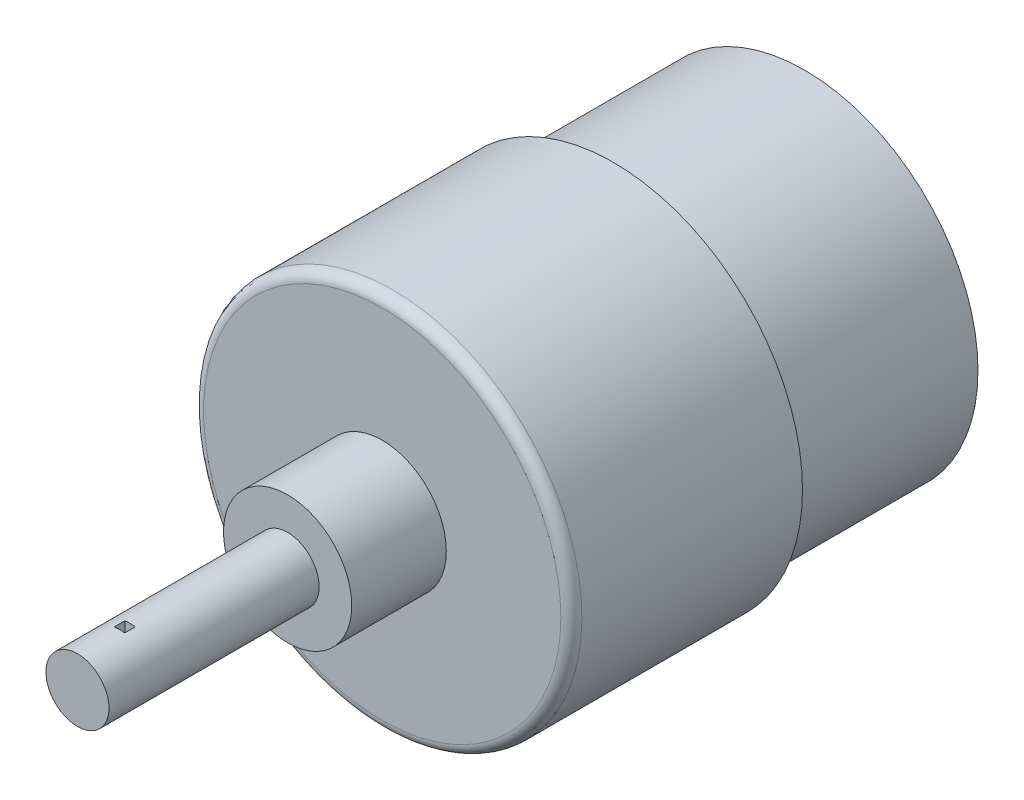
ISO-10303-21;
HEADER;
FILE_DESCRIPTION(('STEP AP214'),'2;1');
FILE_NAME('part.step','',(''),(''),'','','');
FILE_SCHEMA(('AUTOMOTIVE_DESIGN { 1 0 10303 214 1 1 1 1 }'));
ENDSEC;
DATA;
#1=APPLICATION_CONTEXT('core data for automotive mechanical design processes');
#2=APPLICATION_PROTOCOL_DEFINITION('international standard','automotive_design',2000,#1);
#3=PRODUCT_CONTEXT('',#1,'mechanical');
#4=PRODUCT('Part','Part','',(#3));
#5=PRODUCT_RELATED_PRODUCT_CATEGORY('part','',(#4));
#6=PRODUCT_DEFINITION_FORMATION('','',#4);
#7=PRODUCT_DEFINITION_CONTEXT('part definition',#1,'design');
#8=PRODUCT_DEFINITION('design','',#6,#7);
#9=PRODUCT_DEFINITION_SHAPE('','',#8);
#10=(LENGTH_UNIT() NAMED_UNIT(*) SI_UNIT(.MILLI.,.METRE.));
#11=(NAMED_UNIT(*) PLANE_ANGLE_UNIT() SI_UNIT($,.RADIAN.));
#12=(NAMED_UNIT(*) SI_UNIT($,.STERADIAN.) SOLID_ANGLE_UNIT());
#13=UNCERTAINTY_MEASURE_WITH_UNIT(LENGTH_MEASURE(1.E-05),#10,'distance_accuracy_value','');
#14=(GEOMETRIC_REPRESENTATION_CONTEXT(3) GLOBAL_UNCERTAINTY_ASSIGNED_CONTEXT((#13)) GLOBAL_UNIT_ASSIGNED_CONTEXT((#10,
#11,#12)) REPRESENTATION_CONTEXT('',''));
#15=CARTESIAN_POINT('',(0.,0.,0.));
#16=DIRECTION('',(0.,0.,1.));
#17=DIRECTION('',(1.,0.,0.));
#18=AXIS2_PLACEMENT_3D('',#15,#16,#17);
#19=CARTESIAN_POINT('',(0.,0.,22.));
#20=DIRECTION('',(0.,0.,-1.));
#21=DIRECTION('',(-1.,0.,0.));
#22=AXIS2_PLACEMENT_3D('',#19,#20,#21);
#23=CYLINDRICAL_SURFACE('',#22,18.);
#24=CARTESIAN_POINT('',(0.,0.,21.));
#25=DIRECTION('',(0.,0.,1.));
#26=DIRECTION('',(1.,0.,0.));
#27=AXIS2_PLACEMENT_3D('',#24,#25,#26);
#28=CIRCLE('',#27,18.);
#29=CARTESIAN_POINT('',(18.,0.,21.));
#30=VERTEX_POINT('',#29);
#31=EDGE_CURVE('E97',#30,#30,#28,.F.);
#32=ORIENTED_EDGE('',*,*,#31,.T.);
#33=EDGE_LOOP('',(#32));
#34=FACE_BOUND('',#33,.T.);
#35=CARTESIAN_POINT('',(0.,0.,0.));
#36=DIRECTION('',(0.,0.,1.));
#37=DIRECTION('',(1.,0.,0.));
#38=AXIS2_PLACEMENT_3D('',#35,#36,#37);
#39=CIRCLE('',#38,18.);
#40=CARTESIAN_POINT('',(18.,0.,0.));
#41=VERTEX_POINT('',#40);
#42=EDGE_CURVE('E106',#41,#41,#39,.T.);
#43=ORIENTED_EDGE('',*,*,#42,.T.);
#44=EDGE_LOOP('',(#43));
#45=FACE_BOUND('',#44,.T.);
#46=ADVANCED_FACE('F33',(#34,#45),#23,.T.);
#47=CARTESIAN_POINT('',(0.,0.,22.));
#48=DIRECTION('',(0.,0.,1.));
#49=DIRECTION('',(1.,0.,0.));
#50=AXIS2_PLACEMENT_3D('',#47,#48,#49);
#51=PLANE('',#50);
#52=CARTESIAN_POINT('',(0.,0.,22.));
#53=DIRECTION('',(0.,0.,1.));
#54=DIRECTION('',(1.,0.,0.));
#55=AXIS2_PLACEMENT_3D('',#52,#53,#54);
#56=CIRCLE('',#55,17.);
#57=CARTESIAN_POINT('',(17.,0.,22.));
#58=VERTEX_POINT('',#57);
#59=EDGE_CURVE('E100',#58,#58,#56,.T.);
#60=ORIENTED_EDGE('',*,*,#59,.T.);
#61=EDGE_LOOP('',(#60));
#62=FACE_BOUND('',#61,.T.);
#63=CARTESIAN_POINT('',(0.,0.,22.));
#64=DIRECTION('',(0.,0.,1.));
#65=DIRECTION('',(1.,0.,0.));
#66=AXIS2_PLACEMENT_3D('',#63,#64,#65);
#67=CIRCLE('',#66,6.1);
#68=CARTESIAN_POINT('',(6.1,0.,22.));
#69=VERTEX_POINT('',#68);
#70=EDGE_CURVE('E110',#69,#69,#67,.T.);
#71=ORIENTED_EDGE('',*,*,#70,.F.);
#72=EDGE_LOOP('',(#71));
#73=FACE_BOUND('',#72,.T.);
#74=ADVANCED_FACE('F145',(#62,#73),#51,.T.);
#75=CARTESIAN_POINT('',(0.,0.,0.));
#76=DIRECTION('',(0.,0.,1.));
#77=DIRECTION('',(1.,0.,0.));
#78=AXIS2_PLACEMENT_3D('',#75,#76,#77);
#79=PLANE('',#78);
#80=CARTESIAN_POINT('',(0.,0.,0.));
#81=DIRECTION('',(0.,0.,1.));
#82=DIRECTION('',(1.,0.,0.));
#83=AXIS2_PLACEMENT_3D('',#80,#81,#82);
#84=CIRCLE('',#83,16.5);
#85=CARTESIAN_POINT('',(16.5,0.,0.));
#86=VERTEX_POINT('',#85);
#87=EDGE_CURVE('E103',#86,#86,#84,.F.);
#88=ORIENTED_EDGE('',*,*,#87,.F.);
#89=EDGE_LOOP('',(#88));
#90=FACE_BOUND('',#89,.T.);
#91=ORIENTED_EDGE('',*,*,#42,.F.);
#92=EDGE_LOOP('',(#91));
#93=FACE_BOUND('',#92,.T.);
#94=ADVANCED_FACE('F150',(#90,#93),#79,.F.);
#95=CARTESIAN_POINT('',(0.,0.,31.));
#96=DIRECTION('',(0.,0.,-1.));
#97=DIRECTION('',(-1.,0.,0.));
#98=AXIS2_PLACEMENT_3D('',#95,#96,#97);
#99=CYLINDRICAL_SURFACE('',#98,6.1);
#100=CARTESIAN_POINT('',(0.,0.,31.));
#101=DIRECTION('',(0.,0.,1.));
#102=DIRECTION('',(1.,0.,0.));
#103=AXIS2_PLACEMENT_3D('',#100,#101,#102);
#104=CIRCLE('',#103,6.1);
#105=CARTESIAN_POINT('',(6.1,0.,31.));
#106=VERTEX_POINT('',#105);
#107=EDGE_CURVE('E109',#106,#106,#104,.T.);
#108=ORIENTED_EDGE('',*,*,#107,.F.);
#109=EDGE_LOOP('',(#108));
#110=FACE_BOUND('',#109,.T.);
#111=ORIENTED_EDGE('',*,*,#70,.T.);
#112=EDGE_LOOP('',(#111));
#113=FACE_BOUND('',#112,.T.);
#114=ADVANCED_FACE('F156',(#110,#113),#99,.T.);
#115=CARTESIAN_POINT('',(0.,0.,31.));
#116=DIRECTION('',(0.,0.,1.));
#117=DIRECTION('',(1.,0.,0.));
#118=AXIS2_PLACEMENT_3D('',#115,#116,#117);
#119=PLANE('',#118);
#120=CARTESIAN_POINT('',(0.,0.,31.));
#121=DIRECTION('',(0.,0.,1.));
#122=DIRECTION('',(1.,0.,0.));
#123=AXIS2_PLACEMENT_3D('',#120,#121,#122);
#124=CIRCLE('',#123,3.);
#125=CARTESIAN_POINT('',(3.,0.,31.));
#126=VERTEX_POINT('',#125);
#127=EDGE_CURVE('E116',#126,#126,#124,.T.);
#128=ORIENTED_EDGE('',*,*,#127,.F.);
#129=EDGE_LOOP('',(#128));
#130=FACE_BOUND('',#129,.T.);
#131=ORIENTED_EDGE('',*,*,#107,.T.);
#132=EDGE_LOOP('',(#131));
#133=FACE_BOUND('',#132,.T.);
#134=ADVANCED_FACE('F161',(#130,#133),#119,.T.);
#135=CARTESIAN_POINT('',(0.,0.,51.));
#136=DIRECTION('',(0.,0.,-1.));
#137=DIRECTION('',(-1.,0.,0.));
#138=AXIS2_PLACEMENT_3D('',#135,#136,#137);
#139=CYLINDRICAL_SURFACE('',#138,3.);
#140=DIRECTION('',(0.,0.,-1.));
#141=VECTOR('',#140,1.);
#142=CARTESIAN_POINT('',(-0.5,2.95803989154981,51.));
#143=LINE('',#142,#141);
#144=CARTESIAN_POINT('',(-0.5,2.95803989154981,47.));
#145=VERTEX_POINT('',#144);
#146=CARTESIAN_POINT('',(-0.5,2.95803989154981,46.));
#147=VERTEX_POINT('',#146);
#148=EDGE_CURVE('E78',#145,#147,#143,.T.);
#149=ORIENTED_EDGE('',*,*,#148,.T.);
#150=CARTESIAN_POINT('',(0.,0.,46.));
#151=DIRECTION('',(0.,0.,-1.));
#152=DIRECTION('',(-1.,0.,0.));
#153=AXIS2_PLACEMENT_3D('',#150,#151,#152);
#154=CIRCLE('',#153,3.);
#155=CARTESIAN_POINT('',(0.5,2.95803989154981,46.));
#156=VERTEX_POINT('',#155);
#157=EDGE_CURVE('E11',#147,#156,#154,.T.);
#158=ORIENTED_EDGE('',*,*,#157,.T.);
#159=DIRECTION('',(0.,0.,-1.));
#160=VECTOR('',#159,1.);
#161=CARTESIAN_POINT('',(0.5,2.95803989154981,51.));
#162=LINE('',#161,#160);
#163=CARTESIAN_POINT('',(0.5,2.95803989154981,47.));
#164=VERTEX_POINT('',#163);
#165=EDGE_CURVE('E37',#156,#164,#162,.F.);
#166=ORIENTED_EDGE('',*,*,#165,.T.);
#167=CARTESIAN_POINT('',(0.,0.,47.));
#168=DIRECTION('',(0.,0.,-1.));
#169=DIRECTION('',(-1.,0.,0.));
#170=AXIS2_PLACEMENT_3D('',#167,#168,#169);
#171=CIRCLE('',#170,3.);
#172=EDGE_CURVE('E73',#145,#164,#171,.T.);
#173=ORIENTED_EDGE('',*,*,#172,.F.);
#174=EDGE_LOOP('',(#149,#158,#166,#173));
#175=FACE_BOUND('',#174,.T.);
#176=DIRECTION('',(0.,0.,-1.));
#177=VECTOR('',#176,1.);
#178=CARTESIAN_POINT('',(0.5,-2.95803989154981,51.));
#179=LINE('',#178,#177);
#180=CARTESIAN_POINT('',(0.5,-2.95803989154981,47.));
#181=VERTEX_POINT('',#180);
#182=CARTESIAN_POINT('',(0.5,-2.95803989154981,46.));
#183=VERTEX_POINT('',#182);
#184=EDGE_CURVE('E86',#181,#183,#179,.T.);
#185=ORIENTED_EDGE('',*,*,#184,.T.);
#186=CARTESIAN_POINT('',(-0.5,-2.95803989154981,46.));
#187=VERTEX_POINT('',#186);
#188=EDGE_CURVE('E43',#183,#187,#154,.T.);
#189=ORIENTED_EDGE('',*,*,#188,.T.);
#190=DIRECTION('',(0.,0.,-1.));
#191=VECTOR('',#190,1.);
#192=CARTESIAN_POINT('',(-0.5,-2.95803989154981,51.));
#193=LINE('',#192,#191);
#194=CARTESIAN_POINT('',(-0.5,-2.95803989154981,47.));
#195=VERTEX_POINT('',#194);
#196=EDGE_CURVE('E94',#187,#195,#193,.F.);
#197=ORIENTED_EDGE('',*,*,#196,.T.);
#198=EDGE_CURVE('E80',#181,#195,#171,.T.);
#199=ORIENTED_EDGE('',*,*,#198,.F.);
#200=EDGE_LOOP('',(#185,#189,#197,#199));
#201=FACE_BOUND('',#200,.T.);
#202=CARTESIAN_POINT('',(0.,0.,51.));
#203=DIRECTION('',(0.,0.,1.));
#204=DIRECTION('',(1.,0.,0.));
#205=AXIS2_PLACEMENT_3D('',#202,#203,#204);
#206=CIRCLE('',#205,3.);
#207=CARTESIAN_POINT('',(3.,0.,51.));
#208=VERTEX_POINT('',#207);
#209=EDGE_CURVE('E113',#208,#208,#206,.T.);
#210=ORIENTED_EDGE('',*,*,#209,.F.);
#211=EDGE_LOOP('',(#210));
#212=FACE_BOUND('',#211,.T.);
#213=ORIENTED_EDGE('',*,*,#127,.T.);
#214=EDGE_LOOP('',(#213));
#215=FACE_BOUND('',#214,.T.);
#216=ADVANCED_FACE('F89',(#175,#201,#212,#215),#139,.T.);
#217=CARTESIAN_POINT('',(0.,0.,51.));
#218=DIRECTION('',(0.,0.,1.));
#219=DIRECTION('',(1.,0.,0.));
#220=AXIS2_PLACEMENT_3D('',#217,#218,#219);
#221=PLANE('',#220);
#222=ORIENTED_EDGE('',*,*,#209,.T.);
#223=EDGE_LOOP('',(#222));
#224=FACE_BOUND('',#223,.T.);
#225=ADVANCED_FACE('F168',(#224),#221,.T.);
#226=CARTESIAN_POINT('',(0.,0.,-18.2));
#227=DIRECTION('',(0.,0.,1.));
#228=DIRECTION('',(1.,0.,0.));
#229=AXIS2_PLACEMENT_3D('',#226,#227,#228);
#230=CYLINDRICAL_SURFACE('',#229,16.5);
#231=CARTESIAN_POINT('',(0.,0.,-18.2));
#232=DIRECTION('',(0.,0.,-1.));
#233=DIRECTION('',(-1.,0.,0.));
#234=AXIS2_PLACEMENT_3D('',#231,#232,#233);
#235=CIRCLE('',#234,16.5);
#236=CARTESIAN_POINT('',(-16.5,0.,-18.2));
#237=VERTEX_POINT('',#236);
#238=EDGE_CURVE('E119',#237,#237,#235,.T.);
#239=ORIENTED_EDGE('',*,*,#238,.F.);
#240=EDGE_LOOP('',(#239));
#241=FACE_BOUND('',#240,.T.);
#242=ORIENTED_EDGE('',*,*,#87,.T.);
#243=EDGE_LOOP('',(#242));
#244=FACE_BOUND('',#243,.T.);
#245=ADVANCED_FACE('F171',(#241,#244),#230,.T.);
#246=CARTESIAN_POINT('',(0.,0.,-18.2));
#247=DIRECTION('',(0.,0.,-1.));
#248=DIRECTION('',(-1.,0.,0.));
#249=AXIS2_PLACEMENT_3D('',#246,#247,#248);
#250=PLANE('',#249);
#251=ORIENTED_EDGE('',*,*,#238,.T.);
#252=EDGE_LOOP('',(#251));
#253=FACE_BOUND('',#252,.T.);
#254=ADVANCED_FACE('F175',(#253),#250,.T.);
#255=CARTESIAN_POINT('',(0.,0.,21.));
#256=DIRECTION('',(0.,0.,1.));
#257=DIRECTION('',(1.,0.,0.));
#258=AXIS2_PLACEMENT_3D('',#255,#256,#257);
#259=TOROIDAL_SURFACE('',#258,17.,1.);
#260=ORIENTED_EDGE('',*,*,#31,.F.);
#261=EDGE_LOOP('',(#260));
#262=FACE_BOUND('',#261,.T.);
#263=ORIENTED_EDGE('',*,*,#59,.F.);
#264=EDGE_LOOP('',(#263));
#265=FACE_BOUND('',#264,.T.);
#266=ADVANCED_FACE('F35',(#262,#265),#259,.T.);
#267=CARTESIAN_POINT('',(0.5,-4.82035146910711,46.));
#268=DIRECTION('',(1.,0.,0.));
#269=DIRECTION('',(0.,0.,-1.));
#270=AXIS2_PLACEMENT_3D('',#267,#268,#269);
#271=PLANE('',#270);
#272=DIRECTION('',(0.,1.,0.));
#273=VECTOR('',#272,1.);
#274=CARTESIAN_POINT('',(0.5,-4.82035146910711,47.));
#275=LINE('',#274,#273);
#276=EDGE_CURVE('E55',#181,#164,#275,.T.);
#277=ORIENTED_EDGE('',*,*,#276,.T.);
#278=ORIENTED_EDGE('',*,*,#165,.F.);
#279=DIRECTION('',(0.,1.,0.));
#280=VECTOR('',#279,1.);
#281=CARTESIAN_POINT('',(0.5,-4.82035146910711,46.));
#282=LINE('',#281,#280);
#283=EDGE_CURVE('E125',#183,#156,#282,.T.);
#284=ORIENTED_EDGE('',*,*,#283,.F.);
#285=ORIENTED_EDGE('',*,*,#184,.F.);
#286=EDGE_LOOP('',(#277,#278,#284,#285));
#287=FACE_BOUND('',#286,.T.);
#288=ADVANCED_FACE('F82',(#287),#271,.F.);
#289=CARTESIAN_POINT('',(-0.5,-4.82035146910711,46.));
#290=DIRECTION('',(-1.,0.,0.));
#291=DIRECTION('',(0.,0.,1.));
#292=AXIS2_PLACEMENT_3D('',#289,#290,#291);
#293=PLANE('',#292);
#294=DIRECTION('',(0.,-1.,0.));
#295=VECTOR('',#294,1.);
#296=CARTESIAN_POINT('',(-0.5,-4.82035146910711,47.));
#297=LINE('',#296,#295);
#298=EDGE_CURVE('E50',#145,#195,#297,.T.);
#299=ORIENTED_EDGE('',*,*,#298,.T.);
#300=ORIENTED_EDGE('',*,*,#196,.F.);
#301=DIRECTION('',(0.,-1.,0.));
#302=VECTOR('',#301,1.);
#303=CARTESIAN_POINT('',(-0.5,-4.82035146910711,46.));
#304=LINE('',#303,#302);
#305=EDGE_CURVE('E124',#147,#187,#304,.T.);
#306=ORIENTED_EDGE('',*,*,#305,.F.);
#307=ORIENTED_EDGE('',*,*,#148,.F.);
#308=EDGE_LOOP('',(#299,#300,#306,#307));
#309=FACE_BOUND('',#308,.T.);
#310=ADVANCED_FACE('F134',(#309),#293,.F.);
#311=CARTESIAN_POINT('',(0.,0.,46.));
#312=DIRECTION('',(0.,0.,-1.));
#313=DIRECTION('',(-1.,0.,0.));
#314=AXIS2_PLACEMENT_3D('',#311,#312,#313);
#315=PLANE('',#314);
#316=ORIENTED_EDGE('',*,*,#305,.T.);
#317=ORIENTED_EDGE('',*,*,#188,.F.);
#318=ORIENTED_EDGE('',*,*,#283,.T.);
#319=ORIENTED_EDGE('',*,*,#157,.F.);
#320=EDGE_LOOP('',(#316,#317,#318,#319));
#321=FACE_BOUND('',#320,.T.);
#322=ADVANCED_FACE('F130',(#321),#315,.F.);
#323=CARTESIAN_POINT('',(0.,0.,47.));
#324=DIRECTION('',(0.,0.,-1.));
#325=DIRECTION('',(-1.,0.,0.));
#326=AXIS2_PLACEMENT_3D('',#323,#324,#325);
#327=PLANE('',#326);
#328=ORIENTED_EDGE('',*,*,#172,.T.);
#329=ORIENTED_EDGE('',*,*,#276,.F.);
#330=ORIENTED_EDGE('',*,*,#198,.T.);
#331=ORIENTED_EDGE('',*,*,#298,.F.);
#332=EDGE_LOOP('',(#328,#329,#330,#331));
#333=FACE_BOUND('',#332,.T.);
#334=ADVANCED_FACE('F74',(#333),#327,.T.);
#335=CLOSED_SHELL('',(#46,#74,#94,#114,#134,#216,#225,#245,#254,#266,#288,#310,#322,#334));
#336=MANIFOLD_SOLID_BREP('B2',#335);
#337=ADVANCED_BREP_SHAPE_REPRESENTATION('',(#18,#336),#14);
#338=SHAPE_DEFINITION_REPRESENTATION(#9,#337);
ENDSEC;
END-ISO-10303-21;
